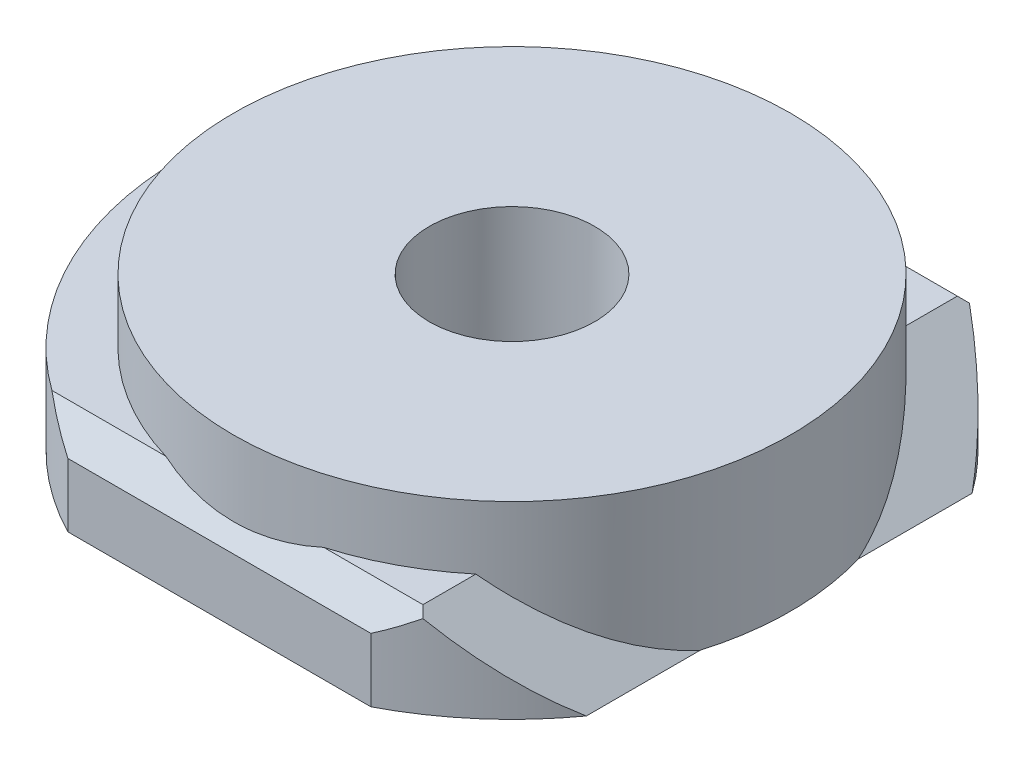
ISO-10303-21;
HEADER;
FILE_DESCRIPTION(('STEP AP214'),'2;1');
FILE_NAME('part.step','',(''),(''),'','','');
FILE_SCHEMA(('AUTOMOTIVE_DESIGN { 1 0 10303 214 1 1 1 1 }'));
ENDSEC;
DATA;
#1=APPLICATION_CONTEXT('core data for automotive mechanical design processes');
#2=APPLICATION_PROTOCOL_DEFINITION('international standard','automotive_design',2000,#1);
#3=PRODUCT_CONTEXT('',#1,'mechanical');
#4=PRODUCT('Part','Part','',(#3));
#5=PRODUCT_RELATED_PRODUCT_CATEGORY('part','',(#4));
#6=PRODUCT_DEFINITION_FORMATION('','',#4);
#7=PRODUCT_DEFINITION_CONTEXT('part definition',#1,'design');
#8=PRODUCT_DEFINITION('design','',#6,#7);
#9=PRODUCT_DEFINITION_SHAPE('','',#8);
#10=(LENGTH_UNIT() NAMED_UNIT(*) SI_UNIT(.MILLI.,.METRE.));
#11=(NAMED_UNIT(*) PLANE_ANGLE_UNIT() SI_UNIT($,.RADIAN.));
#12=(NAMED_UNIT(*) SI_UNIT($,.STERADIAN.) SOLID_ANGLE_UNIT());
#13=UNCERTAINTY_MEASURE_WITH_UNIT(LENGTH_MEASURE(1.E-05),#10,'distance_accuracy_value','');
#14=(GEOMETRIC_REPRESENTATION_CONTEXT(3) GLOBAL_UNCERTAINTY_ASSIGNED_CONTEXT((#13)) GLOBAL_UNIT_ASSIGNED_CONTEXT((#10,
#11,#12)) REPRESENTATION_CONTEXT('',''));
#15=CARTESIAN_POINT('',(0.,0.,0.));
#16=DIRECTION('',(0.,0.,1.));
#17=DIRECTION('',(1.,0.,0.));
#18=AXIS2_PLACEMENT_3D('',#15,#16,#17);
#19=CARTESIAN_POINT('',(8.25,8.25,-11.5));
#20=DIRECTION('',(-0.707106781186548,-0.707106781186548,0.));
#21=DIRECTION('',(0.707106781186548,-0.707106781186548,0.));
#22=AXIS2_PLACEMENT_3D('',#19,#20,#21);
#23=PLANE('',#22);
#24=DIRECTION('',(0.,0.,1.));
#25=VECTOR('',#24,1.);
#26=CARTESIAN_POINT('',(10.5,6.,-11.5));
#27=LINE('',#26,#25);
#28=CARTESIAN_POINT('',(10.5,6.,-7.57974273969771));
#29=VERTEX_POINT('',#28);
#30=CARTESIAN_POINT('',(10.5,6.,-3.10684727658119));
#31=VERTEX_POINT('',#30);
#32=EDGE_CURVE('E294',#29,#31,#27,.T.);
#33=ORIENTED_EDGE('',*,*,#32,.F.);
#34=CARTESIAN_POINT('',(0.,16.5,0.));
#35=DIRECTION('',(-0.707106781186548,-0.707106781186548,0.));
#36=DIRECTION('',(-0.707106781186548,0.707106781186548,0.));
#37=AXIS2_PLACEMENT_3D('',#34,#35,#36);
#38=ELLIPSE('',#37,18.3140656327316,12.95);
#39=CARTESIAN_POINT('',(7.23825622687738,9.26174377312261,-10.7382562268774));
#40=VERTEX_POINT('',#39);
#41=EDGE_CURVE('E285',#29,#40,#38,.F.);
#42=ORIENTED_EDGE('',*,*,#41,.T.);
#43=DIRECTION('',(-0.577350269189628,0.577350269189628,0.577350269189622));
#44=VECTOR('',#43,1.);
#45=CARTESIAN_POINT('',(5.33333333333333,11.1666666666667,-8.83333333333333));
#46=LINE('',#45,#44);
#47=CARTESIAN_POINT('',(7.,9.5,-10.5));
#48=VERTEX_POINT('',#47);
#49=EDGE_CURVE('E245',#40,#48,#46,.T.);
#50=ORIENTED_EDGE('',*,*,#49,.T.);
#51=DIRECTION('',(0.,0.,1.));
#52=VECTOR('',#51,1.);
#53=CARTESIAN_POINT('',(7.,9.5,0.));
#54=LINE('',#53,#52);
#55=CARTESIAN_POINT('',(7.,9.5,-8.42036222498771));
#56=VERTEX_POINT('',#55);
#57=EDGE_CURVE('E288',#48,#56,#54,.T.);
#58=ORIENTED_EDGE('',*,*,#57,.T.);
#59=CARTESIAN_POINT('',(0.,16.5,0.));
#60=DIRECTION('',(-0.707106781186548,-0.707106781186548,0.));
#61=DIRECTION('',(0.707106781186548,-0.707106781186548,0.));
#62=AXIS2_PLACEMENT_3D('',#59,#60,#61);
#63=ELLIPSE('',#62,15.4856385079854,10.95);
#64=EDGE_CURVE('E231',#31,#56,#63,.F.);
#65=ORIENTED_EDGE('',*,*,#64,.F.);
#66=EDGE_LOOP('',(#33,#42,#50,#58,#65));
#67=FACE_BOUND('',#66,.T.);
#68=ADVANCED_FACE('F105',(#67),#23,.F.);
#69=CARTESIAN_POINT('',(10.5,6.,3.10684727658119));
#70=VERTEX_POINT('',#69);
#71=CARTESIAN_POINT('',(10.5,6.,7.57974273969771));
#72=VERTEX_POINT('',#71);
#73=EDGE_CURVE('E295',#70,#72,#27,.T.);
#74=ORIENTED_EDGE('',*,*,#73,.F.);
#75=CARTESIAN_POINT('',(7.,9.5,8.42036222498771));
#76=VERTEX_POINT('',#75);
#77=EDGE_CURVE('E233',#76,#70,#63,.F.);
#78=ORIENTED_EDGE('',*,*,#77,.F.);
#79=CARTESIAN_POINT('',(7.,9.5,10.5));
#80=VERTEX_POINT('',#79);
#81=EDGE_CURVE('E273',#76,#80,#54,.T.);
#82=ORIENTED_EDGE('',*,*,#81,.T.);
#83=DIRECTION('',(-0.577350269189624,0.577350269189624,-0.57735026918963));
#84=VECTOR('',#83,1.);
#85=CARTESIAN_POINT('',(4.66666666666668,11.8333333333333,8.16666666666664));
#86=LINE('',#85,#84);
#87=CARTESIAN_POINT('',(7.23825622687739,9.26174377312261,10.7382562268774));
#88=VERTEX_POINT('',#87);
#89=EDGE_CURVE('E247',#80,#88,#86,.F.);
#90=ORIENTED_EDGE('',*,*,#89,.T.);
#91=EDGE_CURVE('E282',#88,#72,#38,.F.);
#92=ORIENTED_EDGE('',*,*,#91,.T.);
#93=EDGE_LOOP('',(#74,#78,#82,#90,#92));
#94=FACE_BOUND('',#93,.T.);
#95=ADVANCED_FACE('F281',(#94),#23,.F.);
#96=CARTESIAN_POINT('',(0.,-38.6281312654632,0.));
#97=DIRECTION('',(0.,1.,0.));
#98=DIRECTION('',(0.,0.,1.));
#99=AXIS2_PLACEMENT_3D('',#96,#97,#98);
#100=CYLINDRICAL_SURFACE('',#99,12.95);
#101=DIRECTION('',(0.,1.,0.));
#102=VECTOR('',#101,1.);
#103=CARTESIAN_POINT('',(5.95420019817943,-38.6281312654632,11.5));
#104=LINE('',#103,#102);
#105=CARTESIAN_POINT('',(5.95420019817943,8.49999999999999,11.5));
#106=VERTEX_POINT('',#105);
#107=CARTESIAN_POINT('',(5.95420019817943,6.,11.5));
#108=VERTEX_POINT('',#107);
#109=EDGE_CURVE('E213',#106,#108,#104,.F.);
#110=ORIENTED_EDGE('',*,*,#109,.T.);
#111=CARTESIAN_POINT('',(0.,6.,0.));
#112=DIRECTION('',(0.,-1.,0.));
#113=DIRECTION('',(0.,0.,-1.));
#114=AXIS2_PLACEMENT_3D('',#111,#112,#113);
#115=CIRCLE('',#114,12.95);
#116=EDGE_CURVE('E121',#72,#108,#115,.T.);
#117=ORIENTED_EDGE('',*,*,#116,.F.);
#118=ORIENTED_EDGE('',*,*,#91,.F.);
#119=CARTESIAN_POINT('',(0.,19.9999999999999,0.));
#120=DIRECTION('',(0.,-0.707106781186551,-0.707106781186544));
#121=DIRECTION('',(0.,0.707106781186544,-0.707106781186551));
#122=AXIS2_PLACEMENT_3D('',#119,#120,#121);
#123=ELLIPSE('',#122,18.3140656327315,12.95);
#124=EDGE_CURVE('E252',#88,#106,#123,.T.);
#125=ORIENTED_EDGE('',*,*,#124,.T.);
#126=EDGE_LOOP('',(#110,#117,#118,#125));
#127=FACE_BOUND('',#126,.T.);
#128=ADVANCED_FACE('F284',(#127),#100,.T.);
#129=ORIENTED_EDGE('',*,*,#41,.F.);
#130=CARTESIAN_POINT('',(5.95420019817944,6.,-11.5));
#131=VERTEX_POINT('',#130);
#132=EDGE_CURVE('E201',#131,#29,#115,.T.);
#133=ORIENTED_EDGE('',*,*,#132,.F.);
#134=DIRECTION('',(0.,1.,0.));
#135=VECTOR('',#134,1.);
#136=CARTESIAN_POINT('',(5.95420019817944,-38.6281312654632,-11.5));
#137=LINE('',#136,#135);
#138=CARTESIAN_POINT('',(5.95420019817944,8.49999999999998,-11.5));
#139=VERTEX_POINT('',#138);
#140=EDGE_CURVE('E214',#139,#131,#137,.F.);
#141=ORIENTED_EDGE('',*,*,#140,.F.);
#142=CARTESIAN_POINT('',(0.,20.0000000000001,0.));
#143=DIRECTION('',(0.,0.707106781186544,-0.707106781186551));
#144=DIRECTION('',(0.,0.707106781186551,0.707106781186544));
#145=AXIS2_PLACEMENT_3D('',#142,#143,#144);
#146=ELLIPSE('',#145,18.3140656327317,12.95);
#147=EDGE_CURVE('E249',#139,#40,#146,.F.);
#148=ORIENTED_EDGE('',*,*,#147,.T.);
#149=EDGE_LOOP('',(#129,#133,#141,#148));
#150=FACE_BOUND('',#149,.T.);
#151=ADVANCED_FACE('F308',(#150),#100,.T.);
#152=DIRECTION('',(0.,1.,0.));
#153=VECTOR('',#152,1.);
#154=CARTESIAN_POINT('',(-5.95420019817944,-38.6281312654632,-11.5));
#155=LINE('',#154,#153);
#156=CARTESIAN_POINT('',(-5.95420019817944,6.,-11.5));
#157=VERTEX_POINT('',#156);
#158=CARTESIAN_POINT('',(-5.95420019817944,8.49999999999998,-11.5));
#159=VERTEX_POINT('',#158);
#160=EDGE_CURVE('E129',#157,#159,#155,.T.);
#161=ORIENTED_EDGE('',*,*,#160,.F.);
#162=CARTESIAN_POINT('',(0.,6.,0.));
#163=DIRECTION('',(0.,-1.,0.));
#164=DIRECTION('',(0.,0.,-1.));
#165=AXIS2_PLACEMENT_3D('',#162,#163,#164);
#166=CIRCLE('',#165,12.95);
#167=CARTESIAN_POINT('',(-5.95420019817943,6.,11.5));
#168=VERTEX_POINT('',#167);
#169=EDGE_CURVE('E196',#168,#157,#166,.T.);
#170=ORIENTED_EDGE('',*,*,#169,.F.);
#171=DIRECTION('',(0.,1.,0.));
#172=VECTOR('',#171,1.);
#173=CARTESIAN_POINT('',(-5.95420019817943,-38.6281312654632,11.5));
#174=LINE('',#173,#172);
#175=CARTESIAN_POINT('',(-5.95420019817943,8.49999999999999,11.5));
#176=VERTEX_POINT('',#175);
#177=EDGE_CURVE('E205',#168,#176,#174,.T.);
#178=ORIENTED_EDGE('',*,*,#177,.T.);
#179=CARTESIAN_POINT('',(0.,19.9999999999999,0.));
#180=DIRECTION('',(0.,-0.707106781186551,-0.707106781186544));
#181=DIRECTION('',(0.,0.707106781186544,-0.707106781186551));
#182=AXIS2_PLACEMENT_3D('',#179,#180,#181);
#183=ELLIPSE('',#182,18.3140656327315,12.95);
#184=CARTESIAN_POINT('',(-7.57974273969772,9.5,10.5));
#185=VERTEX_POINT('',#184);
#186=EDGE_CURVE('E257',#176,#185,#183,.T.);
#187=ORIENTED_EDGE('',*,*,#186,.T.);
#188=CARTESIAN_POINT('',(0.,9.5,0.));
#189=DIRECTION('',(0.,1.,0.));
#190=DIRECTION('',(0.,0.,1.));
#191=AXIS2_PLACEMENT_3D('',#188,#189,#190);
#192=CIRCLE('',#191,12.95);
#193=CARTESIAN_POINT('',(-7.57974273969771,9.5,-10.5));
#194=VERTEX_POINT('',#193);
#195=EDGE_CURVE('E216',#194,#185,#192,.T.);
#196=ORIENTED_EDGE('',*,*,#195,.F.);
#197=CARTESIAN_POINT('',(0.,20.0000000000001,0.));
#198=DIRECTION('',(0.,0.707106781186544,-0.707106781186551));
#199=DIRECTION('',(0.,0.707106781186551,0.707106781186544));
#200=AXIS2_PLACEMENT_3D('',#197,#198,#199);
#201=ELLIPSE('',#200,18.3140656327317,12.95);
#202=EDGE_CURVE('E255',#194,#159,#201,.F.);
#203=ORIENTED_EDGE('',*,*,#202,.T.);
#204=EDGE_LOOP('',(#161,#170,#178,#187,#196,#203));
#205=FACE_BOUND('',#204,.T.);
#206=ADVANCED_FACE('F204',(#205),#100,.T.);
#207=CARTESIAN_POINT('',(0.,-2.,0.));
#208=DIRECTION('',(0.,1.,0.));
#209=DIRECTION('',(0.,0.,1.));
#210=AXIS2_PLACEMENT_3D('',#207,#208,#209);
#211=CYLINDRICAL_SURFACE('',#210,10.95);
#212=CARTESIAN_POINT('',(0.,12.,0.));
#213=DIRECTION('',(0.,1.,0.));
#214=DIRECTION('',(0.,0.,1.));
#215=AXIS2_PLACEMENT_3D('',#212,#213,#214);
#216=CIRCLE('',#215,10.95);
#217=CARTESIAN_POINT('',(0.,12.,10.95));
#218=VERTEX_POINT('',#217);
#219=EDGE_CURVE('E224',#218,#218,#216,.T.);
#220=ORIENTED_EDGE('',*,*,#219,.F.);
#221=EDGE_LOOP('',(#220));
#222=FACE_BOUND('',#221,.T.);
#223=ORIENTED_EDGE('',*,*,#77,.T.);
#224=CARTESIAN_POINT('',(0.,6.,0.));
#225=DIRECTION('',(0.,-1.,0.));
#226=DIRECTION('',(0.,0.,-1.));
#227=AXIS2_PLACEMENT_3D('',#224,#225,#226);
#228=CIRCLE('',#227,10.95);
#229=EDGE_CURVE('E297',#70,#31,#228,.F.);
#230=ORIENTED_EDGE('',*,*,#229,.T.);
#231=ORIENTED_EDGE('',*,*,#64,.T.);
#232=CARTESIAN_POINT('',(0.,9.5,0.));
#233=DIRECTION('',(0.,1.,0.));
#234=DIRECTION('',(0.,0.,1.));
#235=AXIS2_PLACEMENT_3D('',#232,#233,#234);
#236=CIRCLE('',#235,10.95);
#237=CARTESIAN_POINT('',(3.10684727658123,9.5,-10.5));
#238=VERTEX_POINT('',#237);
#239=EDGE_CURVE('E227',#238,#56,#236,.F.);
#240=ORIENTED_EDGE('',*,*,#239,.F.);
#241=CARTESIAN_POINT('',(0.,20.0000000000001,0.));
#242=DIRECTION('',(0.,0.707106781186544,-0.707106781186551));
#243=DIRECTION('',(0.,0.707106781186551,0.707106781186544));
#244=AXIS2_PLACEMENT_3D('',#241,#242,#243);
#245=ELLIPSE('',#244,15.4856385079855,10.95);
#246=CARTESIAN_POINT('',(-3.10684727658123,9.5,-10.5));
#247=VERTEX_POINT('',#246);
#248=EDGE_CURVE('E12',#238,#247,#245,.T.);
#249=ORIENTED_EDGE('',*,*,#248,.T.);
#250=CARTESIAN_POINT('',(-3.10684727658125,9.5,10.5));
#251=VERTEX_POINT('',#250);
#252=EDGE_CURVE('E232',#251,#247,#236,.F.);
#253=ORIENTED_EDGE('',*,*,#252,.F.);
#254=CARTESIAN_POINT('',(0.,19.9999999999999,0.));
#255=DIRECTION('',(0.,-0.707106781186551,-0.707106781186544));
#256=DIRECTION('',(0.,0.707106781186544,-0.707106781186551));
#257=AXIS2_PLACEMENT_3D('',#254,#255,#256);
#258=ELLIPSE('',#257,15.4856385079853,10.95);
#259=CARTESIAN_POINT('',(3.10684727658125,9.5,10.5));
#260=VERTEX_POINT('',#259);
#261=EDGE_CURVE('E114',#251,#260,#258,.F.);
#262=ORIENTED_EDGE('',*,*,#261,.T.);
#263=EDGE_CURVE('E228',#76,#260,#236,.F.);
#264=ORIENTED_EDGE('',*,*,#263,.F.);
#265=EDGE_LOOP('',(#223,#230,#231,#240,#249,#253,#262,#264));
#266=FACE_BOUND('',#265,.T.);
#267=ADVANCED_FACE('F264',(#222,#266),#211,.T.);
#268=CARTESIAN_POINT('',(0.,-2.,-11.5));
#269=DIRECTION('',(0.,0.,1.));
#270=DIRECTION('',(1.,0.,0.));
#271=AXIS2_PLACEMENT_3D('',#268,#269,#270);
#272=PLANE('',#271);
#273=DIRECTION('',(1.,0.,0.));
#274=VECTOR('',#273,1.);
#275=CARTESIAN_POINT('',(-5.95420019817944,6.,-11.5));
#276=LINE('',#275,#274);
#277=EDGE_CURVE('E207',#157,#131,#276,.T.);
#278=ORIENTED_EDGE('',*,*,#277,.F.);
#279=ORIENTED_EDGE('',*,*,#160,.T.);
#280=DIRECTION('',(1.,0.,0.));
#281=VECTOR('',#280,1.);
#282=CARTESIAN_POINT('',(5.95420019817944,8.49999999999998,-11.5));
#283=LINE('',#282,#281);
#284=EDGE_CURVE('E259',#159,#139,#283,.T.);
#285=ORIENTED_EDGE('',*,*,#284,.T.);
#286=ORIENTED_EDGE('',*,*,#140,.T.);
#287=EDGE_LOOP('',(#278,#279,#285,#286));
#288=FACE_BOUND('',#287,.T.);
#289=ADVANCED_FACE('F324',(#288),#272,.F.);
#290=CARTESIAN_POINT('',(0.,-2.,11.5));
#291=DIRECTION('',(0.,0.,1.));
#292=DIRECTION('',(1.,0.,0.));
#293=AXIS2_PLACEMENT_3D('',#290,#291,#292);
#294=PLANE('',#293);
#295=ORIENTED_EDGE('',*,*,#177,.F.);
#296=DIRECTION('',(-1.,0.,0.));
#297=VECTOR('',#296,1.);
#298=CARTESIAN_POINT('',(5.95420019817943,6.,11.5));
#299=LINE('',#298,#297);
#300=EDGE_CURVE('E193',#108,#168,#299,.T.);
#301=ORIENTED_EDGE('',*,*,#300,.F.);
#302=ORIENTED_EDGE('',*,*,#109,.F.);
#303=DIRECTION('',(-1.,0.,0.));
#304=VECTOR('',#303,1.);
#305=CARTESIAN_POINT('',(0.,8.49999999999999,11.5));
#306=LINE('',#305,#304);
#307=EDGE_CURVE('E211',#106,#176,#306,.T.);
#308=ORIENTED_EDGE('',*,*,#307,.T.);
#309=EDGE_LOOP('',(#295,#301,#302,#308));
#310=FACE_BOUND('',#309,.T.);
#311=ADVANCED_FACE('F209',(#310),#294,.T.);
#312=CARTESIAN_POINT('',(0.,-2.,0.));
#313=DIRECTION('',(0.,1.,0.));
#314=DIRECTION('',(0.,0.,1.));
#315=AXIS2_PLACEMENT_3D('',#312,#313,#314);
#316=CYLINDRICAL_SURFACE('',#315,3.25);
#317=CARTESIAN_POINT('',(0.,12.,0.));
#318=DIRECTION('',(0.,1.,0.));
#319=DIRECTION('',(0.,0.,1.));
#320=AXIS2_PLACEMENT_3D('',#317,#318,#319);
#321=CIRCLE('',#320,3.25);
#322=CARTESIAN_POINT('',(0.,12.,3.25));
#323=VERTEX_POINT('',#322);
#324=EDGE_CURVE('E291',#323,#323,#321,.T.);
#325=ORIENTED_EDGE('',*,*,#324,.T.);
#326=EDGE_LOOP('',(#325));
#327=FACE_BOUND('',#326,.T.);
#328=CARTESIAN_POINT('',(0.,6.,0.));
#329=DIRECTION('',(0.,-1.,0.));
#330=DIRECTION('',(0.,0.,-1.));
#331=AXIS2_PLACEMENT_3D('',#328,#329,#330);
#332=CIRCLE('',#331,3.25);
#333=CARTESIAN_POINT('',(0.,6.,-3.25));
#334=VERTEX_POINT('',#333);
#335=EDGE_CURVE('E109',#334,#334,#332,.F.);
#336=ORIENTED_EDGE('',*,*,#335,.F.);
#337=EDGE_LOOP('',(#336));
#338=FACE_BOUND('',#337,.T.);
#339=ADVANCED_FACE('F331',(#327,#338),#316,.F.);
#340=CARTESIAN_POINT('',(0.,9.5,0.));
#341=DIRECTION('',(0.,1.,0.));
#342=DIRECTION('',(0.,0.,1.));
#343=AXIS2_PLACEMENT_3D('',#340,#341,#342);
#344=PLANE('',#343);
#345=ORIENTED_EDGE('',*,*,#195,.T.);
#346=DIRECTION('',(1.,0.,0.));
#347=VECTOR('',#346,1.);
#348=CARTESIAN_POINT('',(0.,9.5,10.5));
#349=LINE('',#348,#347);
#350=EDGE_CURVE('E242',#185,#251,#349,.T.);
#351=ORIENTED_EDGE('',*,*,#350,.T.);
#352=ORIENTED_EDGE('',*,*,#252,.T.);
#353=DIRECTION('',(-1.,0.,0.));
#354=VECTOR('',#353,1.);
#355=CARTESIAN_POINT('',(-5.95420019817944,9.5,-10.5));
#356=LINE('',#355,#354);
#357=EDGE_CURVE('E236',#247,#194,#356,.T.);
#358=ORIENTED_EDGE('',*,*,#357,.T.);
#359=EDGE_LOOP('',(#345,#351,#352,#358));
#360=FACE_BOUND('',#359,.T.);
#361=ADVANCED_FACE('F321',(#360),#344,.T.);
#362=ORIENTED_EDGE('',*,*,#57,.F.);
#363=DIRECTION('',(-1.,0.,0.));
#364=VECTOR('',#363,1.);
#365=CARTESIAN_POINT('',(-5.95420019817944,9.5,-10.5));
#366=LINE('',#365,#364);
#367=EDGE_CURVE('E238',#48,#238,#366,.T.);
#368=ORIENTED_EDGE('',*,*,#367,.T.);
#369=ORIENTED_EDGE('',*,*,#239,.T.);
#370=EDGE_LOOP('',(#362,#368,#369));
#371=FACE_BOUND('',#370,.T.);
#372=ADVANCED_FACE('F317',(#371),#344,.T.);
#373=ORIENTED_EDGE('',*,*,#263,.T.);
#374=DIRECTION('',(1.,0.,0.));
#375=VECTOR('',#374,1.);
#376=CARTESIAN_POINT('',(0.,9.5,10.5));
#377=LINE('',#376,#375);
#378=EDGE_CURVE('E240',#260,#80,#377,.T.);
#379=ORIENTED_EDGE('',*,*,#378,.T.);
#380=ORIENTED_EDGE('',*,*,#81,.F.);
#381=EDGE_LOOP('',(#373,#379,#380));
#382=FACE_BOUND('',#381,.T.);
#383=ADVANCED_FACE('F271',(#382),#344,.T.);
#384=CARTESIAN_POINT('',(0.,12.,0.));
#385=DIRECTION('',(0.,1.,0.));
#386=DIRECTION('',(0.,0.,1.));
#387=AXIS2_PLACEMENT_3D('',#384,#385,#386);
#388=PLANE('',#387);
#389=ORIENTED_EDGE('',*,*,#324,.F.);
#390=EDGE_LOOP('',(#389));
#391=FACE_BOUND('',#390,.T.);
#392=ORIENTED_EDGE('',*,*,#219,.T.);
#393=EDGE_LOOP('',(#392));
#394=FACE_BOUND('',#393,.T.);
#395=ADVANCED_FACE('F356',(#391,#394),#388,.T.);
#396=CARTESIAN_POINT('',(0.,9.5,10.5));
#397=DIRECTION('',(0.,-0.707106781186551,-0.707106781186544));
#398=DIRECTION('',(1.,0.,0.));
#399=AXIS2_PLACEMENT_3D('',#396,#397,#398);
#400=PLANE('',#399);
#401=ORIENTED_EDGE('',*,*,#186,.F.);
#402=ORIENTED_EDGE('',*,*,#307,.F.);
#403=ORIENTED_EDGE('',*,*,#124,.F.);
#404=ORIENTED_EDGE('',*,*,#89,.F.);
#405=ORIENTED_EDGE('',*,*,#378,.F.);
#406=ORIENTED_EDGE('',*,*,#261,.F.);
#407=ORIENTED_EDGE('',*,*,#350,.F.);
#408=EDGE_LOOP('',(#401,#402,#403,#404,#405,#406,#407));
#409=FACE_BOUND('',#408,.T.);
#410=ADVANCED_FACE('F275',(#409),#400,.F.);
#411=CARTESIAN_POINT('',(0.,8.49999999999998,-11.5));
#412=DIRECTION('',(0.,0.707106781186544,-0.707106781186551));
#413=DIRECTION('',(-1.,0.,0.));
#414=AXIS2_PLACEMENT_3D('',#411,#412,#413);
#415=PLANE('',#414);
#416=ORIENTED_EDGE('',*,*,#248,.F.);
#417=ORIENTED_EDGE('',*,*,#367,.F.);
#418=ORIENTED_EDGE('',*,*,#49,.F.);
#419=ORIENTED_EDGE('',*,*,#147,.F.);
#420=ORIENTED_EDGE('',*,*,#284,.F.);
#421=ORIENTED_EDGE('',*,*,#202,.F.);
#422=ORIENTED_EDGE('',*,*,#357,.F.);
#423=EDGE_LOOP('',(#416,#417,#418,#419,#420,#421,#422));
#424=FACE_BOUND('',#423,.T.);
#425=ADVANCED_FACE('F107',(#424),#415,.T.);
#426=CARTESIAN_POINT('',(0.,6.,0.));
#427=DIRECTION('',(0.,-1.,0.));
#428=DIRECTION('',(0.,0.,-1.));
#429=AXIS2_PLACEMENT_3D('',#426,#427,#428);
#430=PLANE('',#429);
#431=ORIENTED_EDGE('',*,*,#335,.T.);
#432=EDGE_LOOP('',(#431));
#433=FACE_BOUND('',#432,.T.);
#434=ORIENTED_EDGE('',*,*,#32,.T.);
#435=ORIENTED_EDGE('',*,*,#229,.F.);
#436=ORIENTED_EDGE('',*,*,#73,.T.);
#437=ORIENTED_EDGE('',*,*,#116,.T.);
#438=ORIENTED_EDGE('',*,*,#300,.T.);
#439=ORIENTED_EDGE('',*,*,#169,.T.);
#440=ORIENTED_EDGE('',*,*,#277,.T.);
#441=ORIENTED_EDGE('',*,*,#132,.T.);
#442=EDGE_LOOP('',(#434,#435,#436,#437,#438,#439,#440,#441));
#443=FACE_BOUND('',#442,.T.);
#444=ADVANCED_FACE('F195',(#433,#443),#430,.T.);
#445=CLOSED_SHELL('',(#68,#95,#128,#151,#206,#267,#289,#311,#339,#361,#372,#383,#395,#410,#425,#444));
#446=MANIFOLD_SOLID_BREP('B2',#445);
#447=ADVANCED_BREP_SHAPE_REPRESENTATION('',(#18,#446),#14);
#448=SHAPE_DEFINITION_REPRESENTATION(#9,#447);
ENDSEC;
END-ISO-10303-21;
